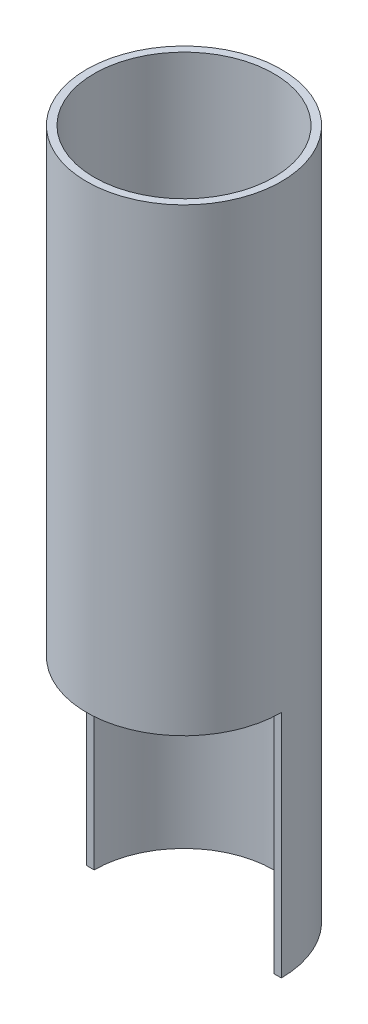
ISO-10303-21;
HEADER;
FILE_DESCRIPTION(('STEP AP214'),'2;1');
FILE_NAME('part.step','',(''),(''),'','','');
FILE_SCHEMA(('AUTOMOTIVE_DESIGN { 1 0 10303 214 1 1 1 1 }'));
ENDSEC;
DATA;
#1=APPLICATION_CONTEXT('core data for automotive mechanical design processes');
#2=APPLICATION_PROTOCOL_DEFINITION('international standard','automotive_design',2000,#1);
#3=PRODUCT_CONTEXT('',#1,'mechanical');
#4=PRODUCT('Part','Part','',(#3));
#5=PRODUCT_RELATED_PRODUCT_CATEGORY('part','',(#4));
#6=PRODUCT_DEFINITION_FORMATION('','',#4);
#7=PRODUCT_DEFINITION_CONTEXT('part definition',#1,'design');
#8=PRODUCT_DEFINITION('design','',#6,#7);
#9=PRODUCT_DEFINITION_SHAPE('','',#8);
#10=(LENGTH_UNIT() NAMED_UNIT(*) SI_UNIT(.MILLI.,.METRE.));
#11=(NAMED_UNIT(*) PLANE_ANGLE_UNIT() SI_UNIT($,.RADIAN.));
#12=(NAMED_UNIT(*) SI_UNIT($,.STERADIAN.) SOLID_ANGLE_UNIT());
#13=UNCERTAINTY_MEASURE_WITH_UNIT(LENGTH_MEASURE(1.E-05),#10,'distance_accuracy_value','');
#14=(GEOMETRIC_REPRESENTATION_CONTEXT(3) GLOBAL_UNCERTAINTY_ASSIGNED_CONTEXT((#13)) GLOBAL_UNIT_ASSIGNED_CONTEXT((#10,
#11,#12)) REPRESENTATION_CONTEXT('',''));
#15=CARTESIAN_POINT('',(0.,0.,0.));
#16=DIRECTION('',(0.,0.,1.));
#17=DIRECTION('',(1.,0.,0.));
#18=AXIS2_PLACEMENT_3D('',#15,#16,#17);
#19=CARTESIAN_POINT('',(0.,180.,0.));
#20=DIRECTION('',(0.,-1.,0.));
#21=DIRECTION('',(0.,0.,-1.));
#22=AXIS2_PLACEMENT_3D('',#19,#20,#21);
#23=CYLINDRICAL_SURFACE('',#22,25.4);
#24=CARTESIAN_POINT('',(0.,180.,0.));
#25=DIRECTION('',(0.,1.,0.));
#26=DIRECTION('',(0.,0.,1.));
#27=AXIS2_PLACEMENT_3D('',#24,#25,#26);
#28=CIRCLE('',#27,25.4);
#29=CARTESIAN_POINT('',(0.,180.,25.4));
#30=VERTEX_POINT('',#29);
#31=EDGE_CURVE('E89',#30,#30,#28,.T.);
#32=ORIENTED_EDGE('',*,*,#31,.F.);
#33=EDGE_LOOP('',(#32));
#34=FACE_BOUND('',#33,.T.);
#35=DIRECTION('',(0.,-1.,0.));
#36=VECTOR('',#35,1.);
#37=CARTESIAN_POINT('',(-25.4,180.,0.));
#38=LINE('',#37,#36);
#39=CARTESIAN_POINT('',(-25.4,60.,0.));
#40=VERTEX_POINT('',#39);
#41=CARTESIAN_POINT('',(-25.4,0.,0.));
#42=VERTEX_POINT('',#41);
#43=EDGE_CURVE('E71',#40,#42,#38,.T.);
#44=ORIENTED_EDGE('',*,*,#43,.F.);
#45=CARTESIAN_POINT('',(0.,60.,0.));
#46=DIRECTION('',(0.,1.,0.));
#47=DIRECTION('',(0.,0.,1.));
#48=AXIS2_PLACEMENT_3D('',#45,#46,#47);
#49=CIRCLE('',#48,25.4);
#50=CARTESIAN_POINT('',(25.4,60.,0.));
#51=VERTEX_POINT('',#50);
#52=EDGE_CURVE('E54',#40,#51,#49,.T.);
#53=ORIENTED_EDGE('',*,*,#52,.T.);
#54=DIRECTION('',(0.,-1.,0.));
#55=VECTOR('',#54,1.);
#56=CARTESIAN_POINT('',(25.4,180.,0.));
#57=LINE('',#56,#55);
#58=CARTESIAN_POINT('',(25.4,0.,0.));
#59=VERTEX_POINT('',#58);
#60=EDGE_CURVE('E76',#59,#51,#57,.F.);
#61=ORIENTED_EDGE('',*,*,#60,.F.);
#62=CARTESIAN_POINT('',(0.,0.,0.));
#63=DIRECTION('',(0.,1.,0.));
#64=DIRECTION('',(0.,0.,1.));
#65=AXIS2_PLACEMENT_3D('',#62,#63,#64);
#66=CIRCLE('',#65,25.4);
#67=EDGE_CURVE('E83',#59,#42,#66,.T.);
#68=ORIENTED_EDGE('',*,*,#67,.T.);
#69=EDGE_LOOP('',(#44,#53,#61,#68));
#70=FACE_BOUND('',#69,.T.);
#71=ADVANCED_FACE('F32',(#34,#70),#23,.T.);
#72=CARTESIAN_POINT('',(0.,0.,0.));
#73=DIRECTION('',(0.,1.,0.));
#74=DIRECTION('',(0.,0.,1.));
#75=AXIS2_PLACEMENT_3D('',#72,#73,#74);
#76=PLANE('',#75);
#77=DIRECTION('',(1.,0.,0.));
#78=VECTOR('',#77,1.);
#79=CARTESIAN_POINT('',(-39.9,0.,0.));
#80=LINE('',#79,#78);
#81=CARTESIAN_POINT('',(-23.45,0.,0.));
#82=VERTEX_POINT('',#81);
#83=EDGE_CURVE('E46',#42,#82,#80,.T.);
#84=ORIENTED_EDGE('',*,*,#83,.F.);
#85=ORIENTED_EDGE('',*,*,#67,.F.);
#86=CARTESIAN_POINT('',(23.45,0.,0.));
#87=VERTEX_POINT('',#86);
#88=EDGE_CURVE('E86',#87,#59,#80,.T.);
#89=ORIENTED_EDGE('',*,*,#88,.F.);
#90=CARTESIAN_POINT('',(0.,0.,0.));
#91=DIRECTION('',(0.,1.,0.));
#92=DIRECTION('',(0.,0.,1.));
#93=AXIS2_PLACEMENT_3D('',#90,#91,#92);
#94=CIRCLE('',#93,23.45);
#95=EDGE_CURVE('E85',#87,#82,#94,.T.);
#96=ORIENTED_EDGE('',*,*,#95,.T.);
#97=EDGE_LOOP('',(#84,#85,#89,#96));
#98=FACE_BOUND('',#97,.T.);
#99=ADVANCED_FACE('F81',(#98),#76,.F.);
#100=CARTESIAN_POINT('',(0.,0.,0.));
#101=DIRECTION('',(0.,1.,0.));
#102=DIRECTION('',(0.,0.,1.));
#103=AXIS2_PLACEMENT_3D('',#100,#101,#102);
#104=CYLINDRICAL_SURFACE('',#103,23.45);
#105=CARTESIAN_POINT('',(0.,180.,0.));
#106=DIRECTION('',(0.,1.,0.));
#107=DIRECTION('',(0.,0.,1.));
#108=AXIS2_PLACEMENT_3D('',#105,#106,#107);
#109=CIRCLE('',#108,23.45);
#110=CARTESIAN_POINT('',(0.,180.,23.45));
#111=VERTEX_POINT('',#110);
#112=EDGE_CURVE('E94',#111,#111,#109,.T.);
#113=ORIENTED_EDGE('',*,*,#112,.T.);
#114=EDGE_LOOP('',(#113));
#115=FACE_BOUND('',#114,.T.);
#116=DIRECTION('',(0.,1.,0.));
#117=VECTOR('',#116,1.);
#118=CARTESIAN_POINT('',(23.45,0.,0.));
#119=LINE('',#118,#117);
#120=CARTESIAN_POINT('',(23.45,60.,0.));
#121=VERTEX_POINT('',#120);
#122=EDGE_CURVE('E11',#121,#87,#119,.F.);
#123=ORIENTED_EDGE('',*,*,#122,.F.);
#124=CARTESIAN_POINT('',(0.,60.,0.));
#125=DIRECTION('',(0.,1.,0.));
#126=DIRECTION('',(0.,0.,1.));
#127=AXIS2_PLACEMENT_3D('',#124,#125,#126);
#128=CIRCLE('',#127,23.45);
#129=CARTESIAN_POINT('',(-23.45,60.,0.));
#130=VERTEX_POINT('',#129);
#131=EDGE_CURVE('E39',#121,#130,#128,.F.);
#132=ORIENTED_EDGE('',*,*,#131,.T.);
#133=DIRECTION('',(0.,1.,0.));
#134=VECTOR('',#133,1.);
#135=CARTESIAN_POINT('',(-23.45,0.,0.));
#136=LINE('',#135,#134);
#137=EDGE_CURVE('E92',#82,#130,#136,.T.);
#138=ORIENTED_EDGE('',*,*,#137,.F.);
#139=ORIENTED_EDGE('',*,*,#95,.F.);
#140=EDGE_LOOP('',(#123,#132,#138,#139));
#141=FACE_BOUND('',#140,.T.);
#142=ADVANCED_FACE('F101',(#115,#141),#104,.F.);
#143=CARTESIAN_POINT('',(0.,180.,0.));
#144=DIRECTION('',(0.,1.,0.));
#145=DIRECTION('',(0.,0.,1.));
#146=AXIS2_PLACEMENT_3D('',#143,#144,#145);
#147=PLANE('',#146);
#148=ORIENTED_EDGE('',*,*,#112,.F.);
#149=EDGE_LOOP('',(#148));
#150=FACE_BOUND('',#149,.T.);
#151=ORIENTED_EDGE('',*,*,#31,.T.);
#152=EDGE_LOOP('',(#151));
#153=FACE_BOUND('',#152,.T.);
#154=ADVANCED_FACE('F114',(#150,#153),#147,.T.);
#155=CARTESIAN_POINT('',(-39.9,60.,0.));
#156=DIRECTION('',(0.,1.,0.));
#157=DIRECTION('',(0.,0.,1.));
#158=AXIS2_PLACEMENT_3D('',#155,#156,#157);
#159=PLANE('',#158);
#160=DIRECTION('',(-1.,0.,0.));
#161=VECTOR('',#160,1.);
#162=CARTESIAN_POINT('',(-39.9,60.,0.));
#163=LINE('',#162,#161);
#164=EDGE_CURVE('E73',#130,#40,#163,.T.);
#165=ORIENTED_EDGE('',*,*,#164,.F.);
#166=ORIENTED_EDGE('',*,*,#131,.F.);
#167=EDGE_CURVE('E104',#51,#121,#163,.T.);
#168=ORIENTED_EDGE('',*,*,#167,.F.);
#169=ORIENTED_EDGE('',*,*,#52,.F.);
#170=EDGE_LOOP('',(#165,#166,#168,#169));
#171=FACE_BOUND('',#170,.T.);
#172=ADVANCED_FACE('F103',(#171),#159,.F.);
#173=CARTESIAN_POINT('',(0.,0.,0.));
#174=DIRECTION('',(0.,0.,1.));
#175=DIRECTION('',(1.,0.,0.));
#176=AXIS2_PLACEMENT_3D('',#173,#174,#175);
#177=PLANE('',#176);
#178=ORIENTED_EDGE('',*,*,#43,.T.);
#179=ORIENTED_EDGE('',*,*,#83,.T.);
#180=ORIENTED_EDGE('',*,*,#137,.T.);
#181=ORIENTED_EDGE('',*,*,#164,.T.);
#182=EDGE_LOOP('',(#178,#179,#180,#181));
#183=FACE_BOUND('',#182,.T.);
#184=ADVANCED_FACE('F72',(#183),#177,.T.);
#185=ORIENTED_EDGE('',*,*,#60,.T.);
#186=ORIENTED_EDGE('',*,*,#167,.T.);
#187=ORIENTED_EDGE('',*,*,#122,.T.);
#188=ORIENTED_EDGE('',*,*,#88,.T.);
#189=EDGE_LOOP('',(#185,#186,#187,#188));
#190=FACE_BOUND('',#189,.T.);
#191=ADVANCED_FACE('F106',(#190),#177,.T.);
#192=CLOSED_SHELL('',(#71,#99,#142,#154,#172,#184,#191));
#193=MANIFOLD_SOLID_BREP('B2',#192);
#194=ADVANCED_BREP_SHAPE_REPRESENTATION('',(#18,#193),#14);
#195=SHAPE_DEFINITION_REPRESENTATION(#9,#194);
ENDSEC;
END-ISO-10303-21;
